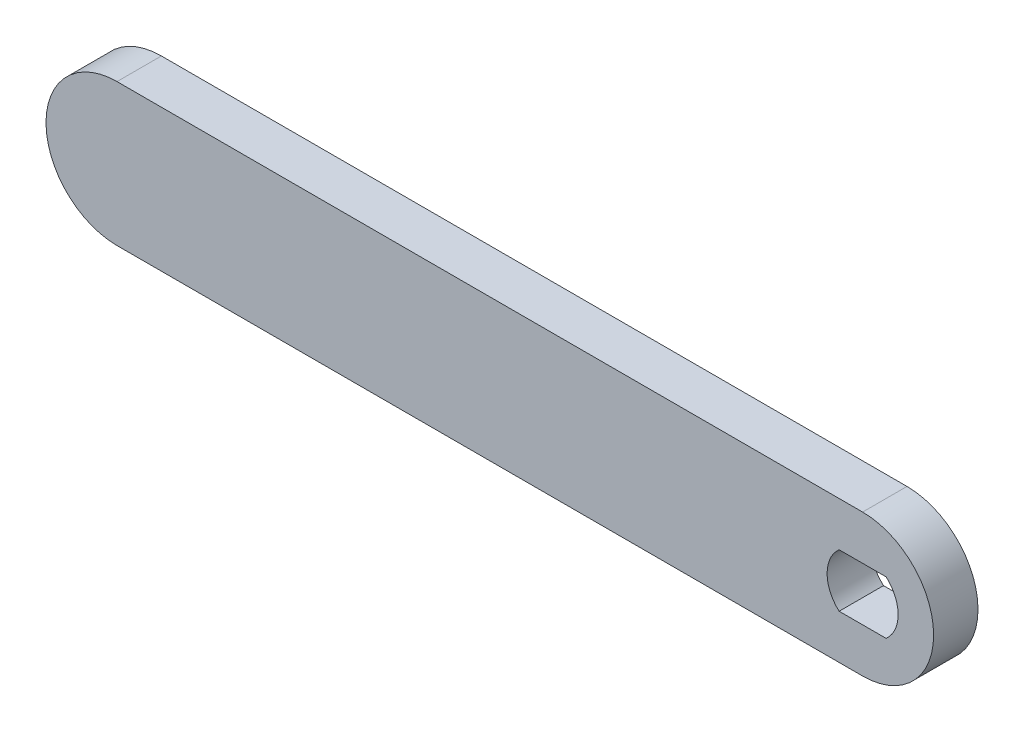
ISO-10303-21;
HEADER;
FILE_DESCRIPTION(('STEP AP214'),'2;1');
FILE_NAME('part.step','',(''),(''),'','','');
FILE_SCHEMA(('AUTOMOTIVE_DESIGN { 1 0 10303 214 1 1 1 1 }'));
ENDSEC;
DATA;
#1=APPLICATION_CONTEXT('core data for automotive mechanical design processes');
#2=APPLICATION_PROTOCOL_DEFINITION('international standard','automotive_design',2000,#1);
#3=PRODUCT_CONTEXT('',#1,'mechanical');
#4=PRODUCT('Part','Part','',(#3));
#5=PRODUCT_RELATED_PRODUCT_CATEGORY('part','',(#4));
#6=PRODUCT_DEFINITION_FORMATION('','',#4);
#7=PRODUCT_DEFINITION_CONTEXT('part definition',#1,'design');
#8=PRODUCT_DEFINITION('design','',#6,#7);
#9=PRODUCT_DEFINITION_SHAPE('','',#8);
#10=(LENGTH_UNIT() NAMED_UNIT(*) SI_UNIT(.MILLI.,.METRE.));
#11=(NAMED_UNIT(*) PLANE_ANGLE_UNIT() SI_UNIT($,.RADIAN.));
#12=(NAMED_UNIT(*) SI_UNIT($,.STERADIAN.) SOLID_ANGLE_UNIT());
#13=UNCERTAINTY_MEASURE_WITH_UNIT(LENGTH_MEASURE(1.E-05),#10,'distance_accuracy_value','');
#14=(GEOMETRIC_REPRESENTATION_CONTEXT(3) GLOBAL_UNCERTAINTY_ASSIGNED_CONTEXT((#13)) GLOBAL_UNIT_ASSIGNED_CONTEXT((#10,
#11,#12)) REPRESENTATION_CONTEXT('',''));
#15=CARTESIAN_POINT('',(0.,0.,0.));
#16=DIRECTION('',(0.,0.,1.));
#17=DIRECTION('',(1.,0.,0.));
#18=AXIS2_PLACEMENT_3D('',#15,#16,#17);
#19=CARTESIAN_POINT('',(0.,0.,-5.));
#20=DIRECTION('',(0.,0.,1.));
#21=DIRECTION('',(1.,0.,0.));
#22=AXIS2_PLACEMENT_3D('',#19,#20,#21);
#23=CYLINDRICAL_SURFACE('',#22,4.);
#24=CARTESIAN_POINT('',(0.,0.,0.));
#25=DIRECTION('',(0.,0.,1.));
#26=DIRECTION('',(1.,0.,0.));
#27=AXIS2_PLACEMENT_3D('',#24,#25,#26);
#28=CIRCLE('',#27,4.);
#29=CARTESIAN_POINT('',(2.64575131106459,-3.,0.));
#30=VERTEX_POINT('',#29);
#31=CARTESIAN_POINT('',(2.64575131106459,3.,0.));
#32=VERTEX_POINT('',#31);
#33=EDGE_CURVE('E143',#30,#32,#28,.T.);
#34=ORIENTED_EDGE('',*,*,#33,.T.);
#35=DIRECTION('',(0.,0.,1.));
#36=VECTOR('',#35,1.);
#37=CARTESIAN_POINT('',(2.64575131106459,3.,-5.));
#38=LINE('',#37,#36);
#39=CARTESIAN_POINT('',(2.64575131106459,3.,-5.));
#40=VERTEX_POINT('',#39);
#41=EDGE_CURVE('E11',#40,#32,#38,.T.);
#42=ORIENTED_EDGE('',*,*,#41,.F.);
#43=CARTESIAN_POINT('',(0.,0.,-5.));
#44=DIRECTION('',(0.,0.,1.));
#45=DIRECTION('',(1.,0.,0.));
#46=AXIS2_PLACEMENT_3D('',#43,#44,#45);
#47=CIRCLE('',#46,4.);
#48=CARTESIAN_POINT('',(2.64575131106459,-3.,-5.));
#49=VERTEX_POINT('',#48);
#50=EDGE_CURVE('E114',#49,#40,#47,.T.);
#51=ORIENTED_EDGE('',*,*,#50,.F.);
#52=DIRECTION('',(0.,0.,1.));
#53=VECTOR('',#52,1.);
#54=CARTESIAN_POINT('',(2.64575131106459,-3.,-5.));
#55=LINE('',#54,#53);
#56=EDGE_CURVE('E122',#49,#30,#55,.T.);
#57=ORIENTED_EDGE('',*,*,#56,.T.);
#58=EDGE_LOOP('',(#34,#42,#51,#57));
#59=FACE_BOUND('',#58,.T.);
#60=ADVANCED_FACE('F35',(#59),#23,.F.);
#61=CARTESIAN_POINT('',(0.,3.,-5.));
#62=DIRECTION('',(0.,1.,0.));
#63=DIRECTION('',(0.,0.,1.));
#64=AXIS2_PLACEMENT_3D('',#61,#62,#63);
#65=PLANE('',#64);
#66=DIRECTION('',(-1.,0.,0.));
#67=VECTOR('',#66,1.);
#68=CARTESIAN_POINT('',(0.,3.,0.));
#69=LINE('',#68,#67);
#70=CARTESIAN_POINT('',(-2.64575131106459,3.,0.));
#71=VERTEX_POINT('',#70);
#72=EDGE_CURVE('E79',#32,#71,#69,.T.);
#73=ORIENTED_EDGE('',*,*,#72,.T.);
#74=DIRECTION('',(0.,0.,1.));
#75=VECTOR('',#74,1.);
#76=CARTESIAN_POINT('',(-2.64575131106459,3.,-5.));
#77=LINE('',#76,#75);
#78=CARTESIAN_POINT('',(-2.64575131106459,3.,-5.));
#79=VERTEX_POINT('',#78);
#80=EDGE_CURVE('E45',#79,#71,#77,.T.);
#81=ORIENTED_EDGE('',*,*,#80,.F.);
#82=DIRECTION('',(-1.,0.,0.));
#83=VECTOR('',#82,1.);
#84=CARTESIAN_POINT('',(0.,3.,-5.));
#85=LINE('',#84,#83);
#86=EDGE_CURVE('E53',#40,#79,#85,.T.);
#87=ORIENTED_EDGE('',*,*,#86,.F.);
#88=ORIENTED_EDGE('',*,*,#41,.T.);
#89=EDGE_LOOP('',(#73,#81,#87,#88));
#90=FACE_BOUND('',#89,.T.);
#91=ADVANCED_FACE('F187',(#90),#65,.F.);
#92=CARTESIAN_POINT('',(-2.64575131106459,-3.,0.));
#93=VERTEX_POINT('',#92);
#94=EDGE_CURVE('E118',#71,#93,#28,.T.);
#95=ORIENTED_EDGE('',*,*,#94,.T.);
#96=DIRECTION('',(0.,0.,1.));
#97=VECTOR('',#96,1.);
#98=CARTESIAN_POINT('',(-2.64575131106459,-3.,-5.));
#99=LINE('',#98,#97);
#100=CARTESIAN_POINT('',(-2.64575131106459,-3.,-5.));
#101=VERTEX_POINT('',#100);
#102=EDGE_CURVE('E116',#101,#93,#99,.T.);
#103=ORIENTED_EDGE('',*,*,#102,.F.);
#104=EDGE_CURVE('E107',#79,#101,#47,.T.);
#105=ORIENTED_EDGE('',*,*,#104,.F.);
#106=ORIENTED_EDGE('',*,*,#80,.T.);
#107=EDGE_LOOP('',(#95,#103,#105,#106));
#108=FACE_BOUND('',#107,.T.);
#109=ADVANCED_FACE('F117',(#108),#23,.F.);
#110=CARTESIAN_POINT('',(-84.,0.,-5.));
#111=DIRECTION('',(0.,0.,1.));
#112=DIRECTION('',(1.,0.,0.));
#113=AXIS2_PLACEMENT_3D('',#110,#111,#112);
#114=CYLINDRICAL_SURFACE('',#113,8.00000000000001);
#115=CARTESIAN_POINT('',(-84.,0.,0.));
#116=DIRECTION('',(0.,0.,1.));
#117=DIRECTION('',(1.,0.,0.));
#118=AXIS2_PLACEMENT_3D('',#115,#116,#117);
#119=CIRCLE('',#118,8.00000000000001);
#120=CARTESIAN_POINT('',(-84.,8.00000000000001,0.));
#121=VERTEX_POINT('',#120);
#122=CARTESIAN_POINT('',(-84.,-8.00000000000001,0.));
#123=VERTEX_POINT('',#122);
#124=EDGE_CURVE('E131',#121,#123,#119,.T.);
#125=ORIENTED_EDGE('',*,*,#124,.F.);
#126=DIRECTION('',(0.,0.,1.));
#127=VECTOR('',#126,1.);
#128=CARTESIAN_POINT('',(-84.,8.00000000000001,-5.));
#129=LINE('',#128,#127);
#130=CARTESIAN_POINT('',(-84.,8.00000000000001,-5.));
#131=VERTEX_POINT('',#130);
#132=EDGE_CURVE('E152',#131,#121,#129,.T.);
#133=ORIENTED_EDGE('',*,*,#132,.F.);
#134=CARTESIAN_POINT('',(-84.,0.,-5.));
#135=DIRECTION('',(0.,0.,1.));
#136=DIRECTION('',(1.,0.,0.));
#137=AXIS2_PLACEMENT_3D('',#134,#135,#136);
#138=CIRCLE('',#137,8.00000000000001);
#139=CARTESIAN_POINT('',(-84.,-8.00000000000001,-5.));
#140=VERTEX_POINT('',#139);
#141=EDGE_CURVE('E148',#131,#140,#138,.T.);
#142=ORIENTED_EDGE('',*,*,#141,.T.);
#143=DIRECTION('',(0.,0.,1.));
#144=VECTOR('',#143,1.);
#145=CARTESIAN_POINT('',(-84.,-8.00000000000001,-5.));
#146=LINE('',#145,#144);
#147=EDGE_CURVE('E39',#140,#123,#146,.T.);
#148=ORIENTED_EDGE('',*,*,#147,.T.);
#149=EDGE_LOOP('',(#125,#133,#142,#148));
#150=FACE_BOUND('',#149,.T.);
#151=ADVANCED_FACE('F37',(#150),#114,.T.);
#152=CARTESIAN_POINT('',(0.,8.,-5.));
#153=DIRECTION('',(0.,1.,0.));
#154=DIRECTION('',(0.,0.,1.));
#155=AXIS2_PLACEMENT_3D('',#152,#153,#154);
#156=PLANE('',#155);
#157=DIRECTION('',(-1.,0.,0.));
#158=VECTOR('',#157,1.);
#159=CARTESIAN_POINT('',(0.,8.,0.));
#160=LINE('',#159,#158);
#161=CARTESIAN_POINT('',(0.,8.,0.));
#162=VERTEX_POINT('',#161);
#163=EDGE_CURVE('E140',#162,#121,#160,.T.);
#164=ORIENTED_EDGE('',*,*,#163,.F.);
#165=DIRECTION('',(0.,0.,1.));
#166=VECTOR('',#165,1.);
#167=CARTESIAN_POINT('',(0.,8.,-5.));
#168=LINE('',#167,#166);
#169=CARTESIAN_POINT('',(0.,8.,-5.));
#170=VERTEX_POINT('',#169);
#171=EDGE_CURVE('E154',#170,#162,#168,.T.);
#172=ORIENTED_EDGE('',*,*,#171,.F.);
#173=DIRECTION('',(-1.,0.,0.));
#174=VECTOR('',#173,1.);
#175=CARTESIAN_POINT('',(0.,8.,-5.));
#176=LINE('',#175,#174);
#177=EDGE_CURVE('E127',#170,#131,#176,.T.);
#178=ORIENTED_EDGE('',*,*,#177,.T.);
#179=ORIENTED_EDGE('',*,*,#132,.T.);
#180=EDGE_LOOP('',(#164,#172,#178,#179));
#181=FACE_BOUND('',#180,.T.);
#182=ADVANCED_FACE('F166',(#181),#156,.T.);
#183=CARTESIAN_POINT('',(0.,0.,-5.));
#184=DIRECTION('',(0.,0.,1.));
#185=DIRECTION('',(1.,0.,0.));
#186=AXIS2_PLACEMENT_3D('',#183,#184,#185);
#187=CYLINDRICAL_SURFACE('',#186,8.);
#188=CARTESIAN_POINT('',(0.,0.,0.));
#189=DIRECTION('',(0.,0.,1.));
#190=DIRECTION('',(1.,0.,0.));
#191=AXIS2_PLACEMENT_3D('',#188,#189,#190);
#192=CIRCLE('',#191,8.);
#193=CARTESIAN_POINT('',(0.,-8.,0.));
#194=VERTEX_POINT('',#193);
#195=EDGE_CURVE('E137',#194,#162,#192,.T.);
#196=ORIENTED_EDGE('',*,*,#195,.F.);
#197=DIRECTION('',(0.,0.,1.));
#198=VECTOR('',#197,1.);
#199=CARTESIAN_POINT('',(0.,-8.,-5.));
#200=LINE('',#199,#198);
#201=CARTESIAN_POINT('',(0.,-8.,-5.));
#202=VERTEX_POINT('',#201);
#203=EDGE_CURVE('E155',#202,#194,#200,.T.);
#204=ORIENTED_EDGE('',*,*,#203,.F.);
#205=CARTESIAN_POINT('',(0.,0.,-5.));
#206=DIRECTION('',(0.,0.,1.));
#207=DIRECTION('',(1.,0.,0.));
#208=AXIS2_PLACEMENT_3D('',#205,#206,#207);
#209=CIRCLE('',#208,8.);
#210=EDGE_CURVE('E174',#202,#170,#209,.T.);
#211=ORIENTED_EDGE('',*,*,#210,.T.);
#212=ORIENTED_EDGE('',*,*,#171,.T.);
#213=EDGE_LOOP('',(#196,#204,#211,#212));
#214=FACE_BOUND('',#213,.T.);
#215=ADVANCED_FACE('F178',(#214),#187,.T.);
#216=CARTESIAN_POINT('',(0.,-8.,-5.));
#217=DIRECTION('',(0.,-1.,0.));
#218=DIRECTION('',(0.,0.,-1.));
#219=AXIS2_PLACEMENT_3D('',#216,#217,#218);
#220=PLANE('',#219);
#221=DIRECTION('',(1.,0.,0.));
#222=VECTOR('',#221,1.);
#223=CARTESIAN_POINT('',(0.,-8.,0.));
#224=LINE('',#223,#222);
#225=EDGE_CURVE('E134',#123,#194,#224,.T.);
#226=ORIENTED_EDGE('',*,*,#225,.F.);
#227=ORIENTED_EDGE('',*,*,#147,.F.);
#228=DIRECTION('',(1.,0.,0.));
#229=VECTOR('',#228,1.);
#230=CARTESIAN_POINT('',(0.,-8.,-5.));
#231=LINE('',#230,#229);
#232=EDGE_CURVE('E172',#140,#202,#231,.T.);
#233=ORIENTED_EDGE('',*,*,#232,.T.);
#234=ORIENTED_EDGE('',*,*,#203,.T.);
#235=EDGE_LOOP('',(#226,#227,#233,#234));
#236=FACE_BOUND('',#235,.T.);
#237=ADVANCED_FACE('F161',(#236),#220,.T.);
#238=CARTESIAN_POINT('',(0.,-3.,-5.));
#239=DIRECTION('',(0.,1.,0.));
#240=DIRECTION('',(0.,0.,1.));
#241=AXIS2_PLACEMENT_3D('',#238,#239,#240);
#242=PLANE('',#241);
#243=DIRECTION('',(-1.,0.,0.));
#244=VECTOR('',#243,1.);
#245=CARTESIAN_POINT('',(0.,-3.,0.));
#246=LINE('',#245,#244);
#247=EDGE_CURVE('E146',#30,#93,#246,.T.);
#248=ORIENTED_EDGE('',*,*,#247,.F.);
#249=ORIENTED_EDGE('',*,*,#56,.F.);
#250=DIRECTION('',(-1.,0.,0.));
#251=VECTOR('',#250,1.);
#252=CARTESIAN_POINT('',(0.,-3.,-5.));
#253=LINE('',#252,#251);
#254=EDGE_CURVE('E111',#49,#101,#253,.T.);
#255=ORIENTED_EDGE('',*,*,#254,.T.);
#256=ORIENTED_EDGE('',*,*,#102,.T.);
#257=EDGE_LOOP('',(#248,#249,#255,#256));
#258=FACE_BOUND('',#257,.T.);
#259=ADVANCED_FACE('F124',(#258),#242,.T.);
#260=CARTESIAN_POINT('',(0.,0.,-5.));
#261=DIRECTION('',(0.,0.,1.));
#262=DIRECTION('',(1.,0.,0.));
#263=AXIS2_PLACEMENT_3D('',#260,#261,#262);
#264=PLANE('',#263);
#265=ORIENTED_EDGE('',*,*,#141,.F.);
#266=ORIENTED_EDGE('',*,*,#177,.F.);
#267=ORIENTED_EDGE('',*,*,#210,.F.);
#268=ORIENTED_EDGE('',*,*,#232,.F.);
#269=EDGE_LOOP('',(#265,#266,#267,#268));
#270=FACE_BOUND('',#269,.T.);
#271=ORIENTED_EDGE('',*,*,#50,.T.);
#272=ORIENTED_EDGE('',*,*,#86,.T.);
#273=ORIENTED_EDGE('',*,*,#104,.T.);
#274=ORIENTED_EDGE('',*,*,#254,.F.);
#275=EDGE_LOOP('',(#271,#272,#273,#274));
#276=FACE_BOUND('',#275,.T.);
#277=ADVANCED_FACE('F109',(#270,#276),#264,.F.);
#278=CARTESIAN_POINT('',(0.,0.,0.));
#279=DIRECTION('',(0.,0.,1.));
#280=DIRECTION('',(1.,0.,0.));
#281=AXIS2_PLACEMENT_3D('',#278,#279,#280);
#282=PLANE('',#281);
#283=ORIENTED_EDGE('',*,*,#124,.T.);
#284=ORIENTED_EDGE('',*,*,#225,.T.);
#285=ORIENTED_EDGE('',*,*,#195,.T.);
#286=ORIENTED_EDGE('',*,*,#163,.T.);
#287=EDGE_LOOP('',(#283,#284,#285,#286));
#288=FACE_BOUND('',#287,.T.);
#289=ORIENTED_EDGE('',*,*,#33,.F.);
#290=ORIENTED_EDGE('',*,*,#247,.T.);
#291=ORIENTED_EDGE('',*,*,#94,.F.);
#292=ORIENTED_EDGE('',*,*,#72,.F.);
#293=EDGE_LOOP('',(#289,#290,#291,#292));
#294=FACE_BOUND('',#293,.T.);
#295=ADVANCED_FACE('F163',(#288,#294),#282,.T.);
#296=CLOSED_SHELL('',(#60,#91,#109,#151,#182,#215,#237,#259,#277,#295));
#297=MANIFOLD_SOLID_BREP('B2',#296);
#298=ADVANCED_BREP_SHAPE_REPRESENTATION('',(#18,#297),#14);
#299=SHAPE_DEFINITION_REPRESENTATION(#9,#298);
ENDSEC;
END-ISO-10303-21;
